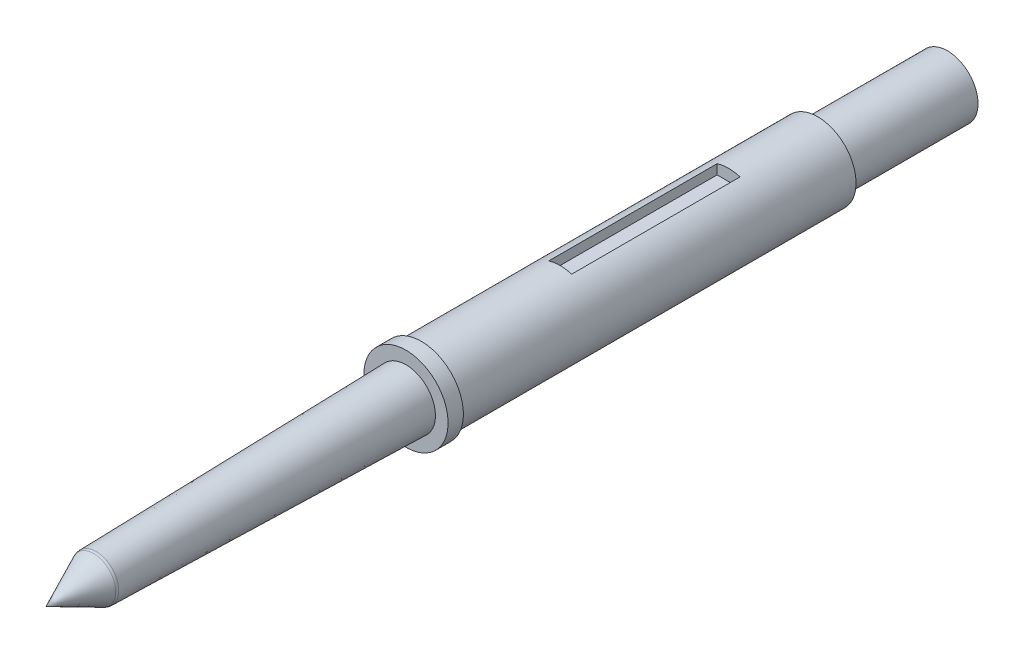
ISO-10303-21;
HEADER;
FILE_DESCRIPTION(('STEP AP214'),'2;1');
FILE_NAME('part.step','',(''),(''),'','','');
FILE_SCHEMA(('AUTOMOTIVE_DESIGN { 1 0 10303 214 1 1 1 1 }'));
ENDSEC;
DATA;
#1=APPLICATION_CONTEXT('core data for automotive mechanical design processes');
#2=APPLICATION_PROTOCOL_DEFINITION('international standard','automotive_design',2000,#1);
#3=PRODUCT_CONTEXT('',#1,'mechanical');
#4=PRODUCT('Part','Part','',(#3));
#5=PRODUCT_RELATED_PRODUCT_CATEGORY('part','',(#4));
#6=PRODUCT_DEFINITION_FORMATION('','',#4);
#7=PRODUCT_DEFINITION_CONTEXT('part definition',#1,'design');
#8=PRODUCT_DEFINITION('design','',#6,#7);
#9=PRODUCT_DEFINITION_SHAPE('','',#8);
#10=(LENGTH_UNIT() NAMED_UNIT(*) SI_UNIT(.MILLI.,.METRE.));
#11=(NAMED_UNIT(*) PLANE_ANGLE_UNIT() SI_UNIT($,.RADIAN.));
#12=(NAMED_UNIT(*) SI_UNIT($,.STERADIAN.) SOLID_ANGLE_UNIT());
#13=UNCERTAINTY_MEASURE_WITH_UNIT(LENGTH_MEASURE(1.E-05),#10,'distance_accuracy_value','');
#14=(GEOMETRIC_REPRESENTATION_CONTEXT(3) GLOBAL_UNCERTAINTY_ASSIGNED_CONTEXT((#13)) GLOBAL_UNIT_ASSIGNED_CONTEXT((#10,
#11,#12)) REPRESENTATION_CONTEXT('',''));
#15=CARTESIAN_POINT('',(0.,0.,0.));
#16=DIRECTION('',(0.,0.,1.));
#17=DIRECTION('',(1.,0.,0.));
#18=AXIS2_PLACEMENT_3D('',#15,#16,#17);
#19=CARTESIAN_POINT('',(0.,0.,176.53));
#20=DIRECTION('',(0.,0.,-1.));
#21=DIRECTION('',(-1.,0.,0.));
#22=AXIS2_PLACEMENT_3D('',#19,#20,#21);
#23=TOROIDAL_SURFACE('',#22,3.41945249806693,1.27);
#24=CARTESIAN_POINT('',(0.,0.,176.558072772658));
#25=DIRECTION('',(0.,0.,-1.));
#26=DIRECTION('',(-1.,0.,0.));
#27=AXIS2_PLACEMENT_3D('',#24,#25,#26);
#28=CIRCLE('',#27,4.68914219221872);
#29=CARTESIAN_POINT('',(-4.68914219221872,0.,176.558072772658));
#30=VERTEX_POINT('',#29);
#31=EDGE_CURVE('E115',#30,#30,#28,.T.);
#32=ORIENTED_EDGE('',*,*,#31,.F.);
#33=EDGE_LOOP('',(#32));
#34=FACE_BOUND('',#33,.T.);
#35=CARTESIAN_POINT('',(0.,0.,177.062823543919));
#36=DIRECTION('',(0.,0.,-1.));
#37=DIRECTION('',(-1.,0.,0.));
#38=AXIS2_PLACEMENT_3D('',#35,#36,#37);
#39=CIRCLE('',#38,4.57227471811872);
#40=CARTESIAN_POINT('',(-4.57227471811872,0.,177.062823543919));
#41=VERTEX_POINT('',#40);
#42=EDGE_CURVE('E143',#41,#41,#39,.T.);
#43=ORIENTED_EDGE('',*,*,#42,.T.);
#44=EDGE_LOOP('',(#43));
#45=FACE_BOUND('',#44,.T.);
#46=ADVANCED_FACE('F49',(#34,#45),#23,.T.);
#47=CARTESIAN_POINT('',(0.,0.,177.062823543919));
#48=DIRECTION('',(0.,0.,-1.));
#49=DIRECTION('',(-1.,0.,0.));
#50=AXIS2_PLACEMENT_3D('',#47,#48,#49);
#51=CONICAL_SURFACE('',#50,4.57227471811872,0.432945223243815);
#52=CARTESIAN_POINT('',(0.,0.,186.955441750041));
#53=VERTEX_POINT('',#52);
#54=VERTEX_LOOP('',#53);
#55=FACE_BOUND('',#54,.T.);
#56=ORIENTED_EDGE('',*,*,#42,.F.);
#57=EDGE_LOOP('',(#56));
#58=FACE_BOUND('',#57,.T.);
#59=ADVANCED_FACE('F168',(#55,#58),#51,.T.);
#60=CARTESIAN_POINT('',(0.,0.,0.));
#61=DIRECTION('',(0.,0.,1.));
#62=DIRECTION('',(1.,0.,0.));
#63=AXIS2_PLACEMENT_3D('',#60,#61,#62);
#64=PLANE('',#63);
#65=CARTESIAN_POINT('',(0.,0.,0.));
#66=DIRECTION('',(0.,0.,-1.));
#67=DIRECTION('',(-1.,0.,0.));
#68=AXIS2_PLACEMENT_3D('',#65,#66,#67);
#69=CIRCLE('',#68,6.34999999999999);
#70=CARTESIAN_POINT('',(-6.34999999999999,0.,0.));
#71=VERTEX_POINT('',#70);
#72=EDGE_CURVE('E140',#71,#71,#69,.T.);
#73=ORIENTED_EDGE('',*,*,#72,.T.);
#74=EDGE_LOOP('',(#73));
#75=FACE_BOUND('',#74,.T.);
#76=ADVANCED_FACE('F173',(#75),#64,.F.);
#77=CARTESIAN_POINT('',(0.,0.,0.));
#78=DIRECTION('',(0.,0.,-1.));
#79=DIRECTION('',(-1.,0.,0.));
#80=AXIS2_PLACEMENT_3D('',#77,#78,#79);
#81=CYLINDRICAL_SURFACE('',#80,6.34999999999999);
#82=CARTESIAN_POINT('',(0.,0.,26.8925));
#83=DIRECTION('',(0.,0.,-1.));
#84=DIRECTION('',(-1.,0.,0.));
#85=AXIS2_PLACEMENT_3D('',#82,#83,#84);
#86=CIRCLE('',#85,6.35);
#87=CARTESIAN_POINT('',(-6.34999999999999,0.,26.8924999999999));
#88=VERTEX_POINT('',#87);
#89=EDGE_CURVE('E137',#88,#88,#86,.T.);
#90=CARTESIAN_POINT('',(-6.34999999999999,0.,0.));
#91=CARTESIAN_POINT('',(-6.34999999999999,0.,0.280130208333333));
#92=CARTESIAN_POINT('',(-6.34999999999999,0.,0.560260416666665));
#93=CARTESIAN_POINT('',(-6.34999999999999,0.,1.12052083333333));
#94=CARTESIAN_POINT('',(-6.34999999999999,0.,1.40065104166666));
#95=CARTESIAN_POINT('',(-6.34999999999999,0.,1.96091145833333));
#96=CARTESIAN_POINT('',(-6.34999999999999,0.,2.24104166666666));
#97=CARTESIAN_POINT('',(-6.34999999999999,0.,2.80130208333333));
#98=CARTESIAN_POINT('',(-6.34999999999999,0.,3.08143229166666));
#99=CARTESIAN_POINT('',(-6.34999999999999,0.,3.64169270833333));
#100=CARTESIAN_POINT('',(-6.34999999999999,0.,3.92182291666666));
#101=CARTESIAN_POINT('',(-6.34999999999999,0.,4.48208333333332));
#102=CARTESIAN_POINT('',(-6.34999999999999,0.,4.76221354166666));
#103=CARTESIAN_POINT('',(-6.34999999999999,0.,5.32247395833332));
#104=CARTESIAN_POINT('',(-6.34999999999999,0.,5.60260416666666));
#105=CARTESIAN_POINT('',(-6.34999999999999,0.,6.16286458333332));
#106=CARTESIAN_POINT('',(-6.34999999999999,0.,6.44299479166665));
#107=CARTESIAN_POINT('',(-6.34999999999999,0.,7.00325520833332));
#108=CARTESIAN_POINT('',(-6.34999999999999,0.,7.28338541666665));
#109=CARTESIAN_POINT('',(-6.34999999999999,0.,7.84364583333332));
#110=CARTESIAN_POINT('',(-6.34999999999999,0.,8.12377604166665));
#111=CARTESIAN_POINT('',(-6.34999999999999,0.,8.68403645833332));
#112=CARTESIAN_POINT('',(-6.34999999999999,0.,8.96416666666665));
#113=CARTESIAN_POINT('',(-6.34999999999999,0.,9.52442708333331));
#114=CARTESIAN_POINT('',(-6.34999999999999,0.,9.80455729166665));
#115=CARTESIAN_POINT('',(-6.34999999999999,0.,10.3648177083333));
#116=CARTESIAN_POINT('',(-6.34999999999999,0.,10.6449479166666));
#117=CARTESIAN_POINT('',(-6.34999999999999,0.,11.2052083333333));
#118=CARTESIAN_POINT('',(-6.34999999999999,0.,11.4853385416666));
#119=CARTESIAN_POINT('',(-6.34999999999999,0.,12.0455989583333));
#120=CARTESIAN_POINT('',(-6.34999999999999,0.,12.3257291666666));
#121=CARTESIAN_POINT('',(-6.34999999999999,0.,12.8859895833333));
#122=CARTESIAN_POINT('',(-6.34999999999999,0.,13.1661197916666));
#123=CARTESIAN_POINT('',(-6.34999999999999,0.,13.7263802083333));
#124=CARTESIAN_POINT('',(-6.34999999999999,0.,14.0065104166666));
#125=CARTESIAN_POINT('',(-6.34999999999999,0.,14.5667708333333));
#126=CARTESIAN_POINT('',(-6.34999999999999,0.,14.8469010416666));
#127=CARTESIAN_POINT('',(-6.34999999999999,0.,15.4071614583333));
#128=CARTESIAN_POINT('',(-6.34999999999999,0.,15.6872916666666));
#129=CARTESIAN_POINT('',(-6.34999999999999,0.,16.2475520833333));
#130=CARTESIAN_POINT('',(-6.34999999999999,0.,16.5276822916666));
#131=CARTESIAN_POINT('',(-6.34999999999999,0.,17.0879427083333));
#132=CARTESIAN_POINT('',(-6.34999999999999,0.,17.3680729166666));
#133=CARTESIAN_POINT('',(-6.34999999999999,0.,17.9283333333333));
#134=CARTESIAN_POINT('',(-6.34999999999999,0.,18.2084635416666));
#135=CARTESIAN_POINT('',(-6.34999999999999,0.,18.7687239583333));
#136=CARTESIAN_POINT('',(-6.34999999999999,0.,19.0488541666666));
#137=CARTESIAN_POINT('',(-6.34999999999999,0.,19.6091145833333));
#138=CARTESIAN_POINT('',(-6.34999999999999,0.,19.8892447916666));
#139=CARTESIAN_POINT('',(-6.34999999999999,0.,20.4495052083333));
#140=CARTESIAN_POINT('',(-6.34999999999999,0.,20.7296354166666));
#141=CARTESIAN_POINT('',(-6.34999999999999,0.,21.2898958333333));
#142=CARTESIAN_POINT('',(-6.34999999999999,0.,21.5700260416666));
#143=CARTESIAN_POINT('',(-6.34999999999999,0.,22.1302864583333));
#144=CARTESIAN_POINT('',(-6.34999999999999,0.,22.4104166666666));
#145=CARTESIAN_POINT('',(-6.34999999999999,0.,22.9706770833333));
#146=CARTESIAN_POINT('',(-6.34999999999999,0.,23.2508072916666));
#147=CARTESIAN_POINT('',(-6.34999999999999,0.,23.8110677083333));
#148=CARTESIAN_POINT('',(-6.34999999999999,0.,24.0911979166666));
#149=CARTESIAN_POINT('',(-6.34999999999999,0.,24.6514583333333));
#150=CARTESIAN_POINT('',(-6.34999999999999,0.,24.9315885416666));
#151=CARTESIAN_POINT('',(-6.34999999999999,0.,25.4918489583333));
#152=CARTESIAN_POINT('',(-6.34999999999999,0.,25.7719791666666));
#153=CARTESIAN_POINT('',(-6.34999999999999,0.,26.3322395833333));
#154=CARTESIAN_POINT('',(-6.34999999999999,0.,26.6123697916666));
#155=CARTESIAN_POINT('',(-6.34999999999999,0.,26.8924999999999));
#156=B_SPLINE_CURVE_WITH_KNOTS('',3,(#90,#91,#92,#93,#94,#95,#96,#97,#98,#99,#100,#101,#102,
#103,#104,#105,#106,#107,#108,#109,#110,#111,#112,#113,#114,#115,#116,#117,#118,#119,#120,#121,
#122,#123,#124,#125,#126,#127,#128,#129,#130,#131,#132,#133,#134,#135,#136,#137,#138,#139,#140,
#141,#142,#143,#144,#145,#146,#147,#148,#149,#150,#151,#152,#153,#154,#155),.UNSPECIFIED.,.F.,
.F.,(4,2,2,2,2,2,2,2,2,2,2,2,2,2,2,2,2,2,2,2,2,2,2,2,2,2,2,2,2,2,2,2,4),(0.,0.840390624999998,
1.68078125,2.52117187499999,3.36156249999999,4.20195312499999,5.04234374999999,5.88273437499999,
6.72312499999999,7.56351562499998,8.40390624999998,9.24429687499998,10.0846875,10.925078125,
11.76546875,12.605859375,13.44625,14.286640625,15.12703125,15.967421875,16.8078125,17.648203125,
18.48859375,19.328984375,20.169375,21.009765625,21.85015625,22.690546875,23.5309375,
24.371328125,25.2117187499999,26.0521093749999,26.8924999999999),.UNSPECIFIED.);
#157=EDGE_CURVE('BSEAM204',#71,#88,#156,.T.);
#158=ORIENTED_EDGE('',*,*,#72,.F.);
#159=ORIENTED_EDGE('',*,*,#89,.T.);
#160=ORIENTED_EDGE('',*,*,#157,.T.);
#161=ORIENTED_EDGE('',*,*,#157,.F.);
#162=EDGE_LOOP('',(#158,#160,#159,#161));
#163=FACE_BOUND('',#162,.T.);
#164=ADVANCED_FACE('F204',(#163),#81,.T.);
#165=CARTESIAN_POINT('',(0.,0.,26.8924999999999));
#166=DIRECTION('',(0.,0.,1.));
#167=DIRECTION('',(1.,0.,0.));
#168=AXIS2_PLACEMENT_3D('',#165,#166,#167);
#169=PLANE('',#168);
#170=ORIENTED_EDGE('',*,*,#89,.F.);
#171=EDGE_LOOP('',(#170));
#172=FACE_BOUND('',#171,.T.);
#173=CARTESIAN_POINT('',(0.,0.,26.8924999999999));
#174=DIRECTION('',(0.,0.,-1.));
#175=DIRECTION('',(-1.,0.,0.));
#176=AXIS2_PLACEMENT_3D('',#173,#174,#175);
#177=CIRCLE('',#176,7.93749999999999);
#178=CARTESIAN_POINT('',(-7.93749999999998,0.,26.8924999999999));
#179=VERTEX_POINT('',#178);
#180=EDGE_CURVE('E134',#179,#179,#177,.T.);
#181=ORIENTED_EDGE('',*,*,#180,.T.);
#182=EDGE_LOOP('',(#181));
#183=FACE_BOUND('',#182,.T.);
#184=ADVANCED_FACE('F201',(#172,#183),#169,.F.);
#185=CARTESIAN_POINT('',(0.,0.,0.));
#186=DIRECTION('',(0.,0.,-1.));
#187=DIRECTION('',(-1.,0.,0.));
#188=AXIS2_PLACEMENT_3D('',#185,#186,#187);
#189=CYLINDRICAL_SURFACE('',#188,7.93749999999999);
#190=DIRECTION('',(0.,0.,-1.));
#191=VECTOR('',#190,1.);
#192=CARTESIAN_POINT('',(2.38125,7.57189241124698,0.));
#193=LINE('',#192,#191);
#194=CARTESIAN_POINT('',(2.38125,7.57189241124698,45.3925664027253));
#195=VERTEX_POINT('',#194);
#196=CARTESIAN_POINT('',(2.38125,7.57189241124698,80.3175664027252));
#197=VERTEX_POINT('',#196);
#198=EDGE_CURVE('E13',#195,#197,#193,.F.);
#199=ORIENTED_EDGE('',*,*,#198,.T.);
#200=CARTESIAN_POINT('',(0.,0.,80.3175664027252));
#201=DIRECTION('',(0.,0.,1.));
#202=DIRECTION('',(1.,0.,0.));
#203=AXIS2_PLACEMENT_3D('',#200,#201,#202);
#204=CIRCLE('',#203,7.93749999999999);
#205=CARTESIAN_POINT('',(-2.38124999999999,7.57189241124698,80.3175664027252));
#206=VERTEX_POINT('',#205);
#207=EDGE_CURVE('E146',#197,#206,#204,.T.);
#208=ORIENTED_EDGE('',*,*,#207,.T.);
#209=DIRECTION('',(0.,0.,-1.));
#210=VECTOR('',#209,1.);
#211=CARTESIAN_POINT('',(-2.38124999999999,7.57189241124698,0.));
#212=LINE('',#211,#210);
#213=CARTESIAN_POINT('',(-2.38124999999999,7.57189241124698,45.3925664027253));
#214=VERTEX_POINT('',#213);
#215=EDGE_CURVE('E56',#206,#214,#212,.T.);
#216=ORIENTED_EDGE('',*,*,#215,.T.);
#217=CARTESIAN_POINT('',(0.,0.,45.3925664027253));
#218=DIRECTION('',(0.,0.,-0.999999999999999));
#219=DIRECTION('',(-1.,0.,0.));
#220=AXIS2_PLACEMENT_3D('',#217,#218,#219);
#221=CIRCLE('',#220,7.93749999999999);
#222=EDGE_CURVE('E148',#214,#195,#221,.T.);
#223=ORIENTED_EDGE('',*,*,#222,.T.);
#224=EDGE_LOOP('',(#199,#208,#216,#223));
#225=FACE_BOUND('',#224,.T.);
#226=ORIENTED_EDGE('',*,*,#180,.F.);
#227=EDGE_LOOP('',(#226));
#228=FACE_BOUND('',#227,.T.);
#229=CARTESIAN_POINT('',(0.,0.,109.125));
#230=DIRECTION('',(0.,0.,-1.));
#231=DIRECTION('',(-1.,0.,0.));
#232=AXIS2_PLACEMENT_3D('',#229,#230,#231);
#233=CIRCLE('',#232,7.93749999999999);
#234=CARTESIAN_POINT('',(-7.93749999999999,0.,109.125));
#235=VERTEX_POINT('',#234);
#236=EDGE_CURVE('E131',#235,#235,#233,.T.);
#237=ORIENTED_EDGE('',*,*,#236,.T.);
#238=EDGE_LOOP('',(#237));
#239=FACE_BOUND('',#238,.T.);
#240=ADVANCED_FACE('F151',(#225,#228,#239),#189,.T.);
#241=CARTESIAN_POINT('',(0.,0.,109.125));
#242=DIRECTION('',(0.,0.,1.));
#243=DIRECTION('',(1.,0.,0.));
#244=AXIS2_PLACEMENT_3D('',#241,#242,#243);
#245=PLANE('',#244);
#246=ORIENTED_EDGE('',*,*,#236,.F.);
#247=EDGE_LOOP('',(#246));
#248=FACE_BOUND('',#247,.T.);
#249=CARTESIAN_POINT('',(0.,0.,109.125));
#250=DIRECTION('',(0.,0.,-1.));
#251=DIRECTION('',(-1.,0.,0.));
#252=AXIS2_PLACEMENT_3D('',#249,#250,#251);
#253=CIRCLE('',#252,8.73124999999999);
#254=CARTESIAN_POINT('',(-8.73124999999998,0.,109.125));
#255=VERTEX_POINT('',#254);
#256=EDGE_CURVE('E128',#255,#255,#253,.T.);
#257=ORIENTED_EDGE('',*,*,#256,.T.);
#258=EDGE_LOOP('',(#257));
#259=FACE_BOUND('',#258,.T.);
#260=ADVANCED_FACE('F194',(#248,#259),#245,.F.);
#261=CARTESIAN_POINT('',(0.,0.,0.));
#262=DIRECTION('',(0.,0.,-1.));
#263=DIRECTION('',(-1.,0.,0.));
#264=AXIS2_PLACEMENT_3D('',#261,#262,#263);
#265=CYLINDRICAL_SURFACE('',#264,8.73124999999999);
#266=CARTESIAN_POINT('',(0.,0.,112.3));
#267=DIRECTION('',(0.,0.,-1.));
#268=DIRECTION('',(-1.,0.,0.));
#269=AXIS2_PLACEMENT_3D('',#266,#267,#268);
#270=CIRCLE('',#269,8.73124999999999);
#271=CARTESIAN_POINT('',(-8.73124999999998,0.,112.3));
#272=VERTEX_POINT('',#271);
#273=EDGE_CURVE('E125',#272,#272,#270,.T.);
#274=CARTESIAN_POINT('',(-8.73124999999998,0.,109.125));
#275=CARTESIAN_POINT('',(-8.73124999999998,0.,109.158072916667));
#276=CARTESIAN_POINT('',(-8.73124999999998,0.,109.191145833333));
#277=CARTESIAN_POINT('',(-8.73124999999998,0.,109.257291666667));
#278=CARTESIAN_POINT('',(-8.73124999999998,0.,109.290364583333));
#279=CARTESIAN_POINT('',(-8.73124999999998,0.,109.356510416667));
#280=CARTESIAN_POINT('',(-8.73124999999998,0.,109.389583333333));
#281=CARTESIAN_POINT('',(-8.73124999999998,0.,109.455729166667));
#282=CARTESIAN_POINT('',(-8.73124999999998,0.,109.488802083333));
#283=CARTESIAN_POINT('',(-8.73124999999998,0.,109.554947916667));
#284=CARTESIAN_POINT('',(-8.73124999999998,0.,109.588020833333));
#285=CARTESIAN_POINT('',(-8.73124999999998,0.,109.654166666667));
#286=CARTESIAN_POINT('',(-8.73124999999998,0.,109.687239583333));
#287=CARTESIAN_POINT('',(-8.73124999999998,0.,109.753385416667));
#288=CARTESIAN_POINT('',(-8.73124999999998,0.,109.786458333333));
#289=CARTESIAN_POINT('',(-8.73124999999998,0.,109.852604166667));
#290=CARTESIAN_POINT('',(-8.73124999999998,0.,109.885677083333));
#291=CARTESIAN_POINT('',(-8.73124999999998,0.,109.951822916667));
#292=CARTESIAN_POINT('',(-8.73124999999998,0.,109.984895833333));
#293=CARTESIAN_POINT('',(-8.73124999999998,0.,110.051041666667));
#294=CARTESIAN_POINT('',(-8.73124999999998,0.,110.084114583333));
#295=CARTESIAN_POINT('',(-8.73124999999998,0.,110.150260416667));
#296=CARTESIAN_POINT('',(-8.73124999999998,0.,110.183333333333));
#297=CARTESIAN_POINT('',(-8.73124999999998,0.,110.249479166667));
#298=CARTESIAN_POINT('',(-8.73124999999998,0.,110.282552083333));
#299=CARTESIAN_POINT('',(-8.73124999999998,0.,110.348697916667));
#300=CARTESIAN_POINT('',(-8.73124999999998,0.,110.381770833333));
#301=CARTESIAN_POINT('',(-8.73124999999998,0.,110.447916666667));
#302=CARTESIAN_POINT('',(-8.73124999999998,0.,110.480989583333));
#303=CARTESIAN_POINT('',(-8.73124999999998,0.,110.547135416667));
#304=CARTESIAN_POINT('',(-8.73124999999998,0.,110.580208333333));
#305=CARTESIAN_POINT('',(-8.73124999999998,0.,110.646354166667));
#306=CARTESIAN_POINT('',(-8.73124999999998,0.,110.679427083333));
#307=CARTESIAN_POINT('',(-8.73124999999998,0.,110.745572916667));
#308=CARTESIAN_POINT('',(-8.73124999999998,0.,110.778645833333));
#309=CARTESIAN_POINT('',(-8.73124999999998,0.,110.844791666667));
#310=CARTESIAN_POINT('',(-8.73124999999998,0.,110.877864583333));
#311=CARTESIAN_POINT('',(-8.73124999999998,0.,110.944010416667));
#312=CARTESIAN_POINT('',(-8.73124999999998,0.,110.977083333333));
#313=CARTESIAN_POINT('',(-8.73124999999998,0.,111.043229166667));
#314=CARTESIAN_POINT('',(-8.73124999999998,0.,111.076302083333));
#315=CARTESIAN_POINT('',(-8.73124999999998,0.,111.142447916667));
#316=CARTESIAN_POINT('',(-8.73124999999998,0.,111.175520833333));
#317=CARTESIAN_POINT('',(-8.73124999999998,0.,111.241666666667));
#318=CARTESIAN_POINT('',(-8.73124999999998,0.,111.274739583333));
#319=CARTESIAN_POINT('',(-8.73124999999998,0.,111.340885416667));
#320=CARTESIAN_POINT('',(-8.73124999999998,0.,111.373958333333));
#321=CARTESIAN_POINT('',(-8.73124999999998,0.,111.440104166667));
#322=CARTESIAN_POINT('',(-8.73124999999998,0.,111.473177083333));
#323=CARTESIAN_POINT('',(-8.73124999999998,0.,111.539322916667));
#324=CARTESIAN_POINT('',(-8.73124999999998,0.,111.572395833333));
#325=CARTESIAN_POINT('',(-8.73124999999998,0.,111.638541666667));
#326=CARTESIAN_POINT('',(-8.73124999999998,0.,111.671614583333));
#327=CARTESIAN_POINT('',(-8.73124999999998,0.,111.737760416667));
#328=CARTESIAN_POINT('',(-8.73124999999998,0.,111.770833333333));
#329=CARTESIAN_POINT('',(-8.73124999999998,0.,111.836979166667));
#330=CARTESIAN_POINT('',(-8.73124999999998,0.,111.870052083333));
#331=CARTESIAN_POINT('',(-8.73124999999998,0.,111.936197916667));
#332=CARTESIAN_POINT('',(-8.73124999999998,0.,111.969270833333));
#333=CARTESIAN_POINT('',(-8.73124999999998,0.,112.035416666667));
#334=CARTESIAN_POINT('',(-8.73124999999998,0.,112.068489583333));
#335=CARTESIAN_POINT('',(-8.73124999999998,0.,112.134635416667));
#336=CARTESIAN_POINT('',(-8.73124999999998,0.,112.167708333333));
#337=CARTESIAN_POINT('',(-8.73124999999998,0.,112.233854166667));
#338=CARTESIAN_POINT('',(-8.73124999999998,0.,112.266927083333));
#339=CARTESIAN_POINT('',(-8.73124999999998,0.,112.3));
#340=B_SPLINE_CURVE_WITH_KNOTS('',3,(#274,#275,#276,#277,#278,#279,#280,#281,#282,#283,#284,
#285,#286,#287,#288,#289,#290,#291,#292,#293,#294,#295,#296,#297,#298,#299,#300,#301,#302,#303,
#304,#305,#306,#307,#308,#309,#310,#311,#312,#313,#314,#315,#316,#317,#318,#319,#320,#321,#322,
#323,#324,#325,#326,#327,#328,#329,#330,#331,#332,#333,#334,#335,#336,#337,#338,#339),
.UNSPECIFIED.,.F.,.F.,(4,2,2,2,2,2,2,2,2,2,2,2,2,2,2,2,2,2,2,2,2,2,2,2,2,2,2,2,2,2,2,2,4),(0.,
0.0992187500000047,0.198437499999995,0.297656249999986,0.396874999999991,0.496093749999982,
0.595312499999986,0.694531249999991,0.793749999999996,0.892968749999987,0.992187499999991,
1.09140625,1.19062499999999,1.28984374999999,1.3890625,1.48828124999999,1.58749999999999,
1.68671875,1.78593749999999,1.88515624999999,1.984375,2.08359374999999,2.18281249999999,
2.28203125,2.38124999999999,2.48046874999999,2.5796875,2.67890625,2.77812499999999,2.87734375,
2.9765625,3.07578124999999,3.175),.UNSPECIFIED.);
#341=EDGE_CURVE('BSEAM186',#255,#272,#340,.T.);
#342=ORIENTED_EDGE('',*,*,#256,.F.);
#343=ORIENTED_EDGE('',*,*,#273,.T.);
#344=ORIENTED_EDGE('',*,*,#341,.T.);
#345=ORIENTED_EDGE('',*,*,#341,.F.);
#346=EDGE_LOOP('',(#342,#344,#343,#345));
#347=FACE_BOUND('',#346,.T.);
#348=ADVANCED_FACE('F186',(#347),#265,.T.);
#349=CARTESIAN_POINT('',(0.,0.,112.3));
#350=DIRECTION('',(0.,0.,-1.));
#351=DIRECTION('',(-1.,0.,0.));
#352=AXIS2_PLACEMENT_3D('',#349,#350,#351);
#353=PLANE('',#352);
#354=ORIENTED_EDGE('',*,*,#273,.F.);
#355=EDGE_LOOP('',(#354));
#356=FACE_BOUND('',#355,.T.);
#357=CARTESIAN_POINT('',(0.,0.,112.3));
#358=DIRECTION('',(0.,0.,-1.));
#359=DIRECTION('',(-1.,0.,0.));
#360=AXIS2_PLACEMENT_3D('',#357,#358,#359);
#361=CIRCLE('',#360,6.10988481674404);
#362=CARTESIAN_POINT('',(-6.10988481674404,0.,112.3));
#363=VERTEX_POINT('',#362);
#364=EDGE_CURVE('E122',#363,#363,#361,.T.);
#365=ORIENTED_EDGE('',*,*,#364,.T.);
#366=EDGE_LOOP('',(#365));
#367=FACE_BOUND('',#366,.T.);
#368=ADVANCED_FACE('F180',(#356,#367),#353,.F.);
#369=CARTESIAN_POINT('',(0.,0.,176.558072772658));
#370=DIRECTION('',(0.,0.,-1.));
#371=DIRECTION('',(-1.,0.,0.));
#372=AXIS2_PLACEMENT_3D('',#369,#370,#371);
#373=CONICAL_SURFACE('',#372,4.68914219221872,0.0221063458831507);
#374=CARTESIAN_POINT('',(-6.10988481674404,0.,112.3));
#375=CARTESIAN_POINT('',(-6.09508541440523,0.,112.969354924715));
#376=CARTESIAN_POINT('',(-6.08028601206643,0.,113.63870984943));
#377=CARTESIAN_POINT('',(-6.05068720738882,0.,114.977419698861));
#378=CARTESIAN_POINT('',(-6.03588780505001,0.,115.646774623576));
#379=CARTESIAN_POINT('',(-6.0062890003724,0.,116.985484473006));
#380=CARTESIAN_POINT('',(-5.99148959803359,0.,117.654839397721));
#381=CARTESIAN_POINT('',(-5.96189079335598,0.,118.993549247152));
#382=CARTESIAN_POINT('',(-5.94709139101718,0.,119.662904171867));
#383=CARTESIAN_POINT('',(-5.91749258633957,0.,121.001614021297));
#384=CARTESIAN_POINT('',(-5.90269318400076,0.,121.670968946013));
#385=CARTESIAN_POINT('',(-5.87309437932315,0.,123.009678795443));
#386=CARTESIAN_POINT('',(-5.85829497698435,0.,123.679033720158));
#387=CARTESIAN_POINT('',(-5.82869617230674,0.,125.017743569589));
#388=CARTESIAN_POINT('',(-5.81389676996793,0.,125.687098494304));
#389=CARTESIAN_POINT('',(-5.78429796529032,0.,127.025808343734));
#390=CARTESIAN_POINT('',(-5.76949856295151,0.,127.695163268449));
#391=CARTESIAN_POINT('',(-5.7398997582739,0.,129.03387311788));
#392=CARTESIAN_POINT('',(-5.7251003559351,0.,129.703228042595));
#393=CARTESIAN_POINT('',(-5.69550155125749,0.,131.041937892025));
#394=CARTESIAN_POINT('',(-5.68070214891868,0.,131.71129281674));
#395=CARTESIAN_POINT('',(-5.65110334424107,0.,133.050002666171));
#396=CARTESIAN_POINT('',(-5.63630394190227,0.,133.719357590886));
#397=CARTESIAN_POINT('',(-5.60670513722466,0.,135.058067440316));
#398=CARTESIAN_POINT('',(-5.59190573488585,0.,135.727422365032));
#399=CARTESIAN_POINT('',(-5.56230693020824,0.,137.066132214462));
#400=CARTESIAN_POINT('',(-5.54750752786943,0.,137.735487139177));
#401=CARTESIAN_POINT('',(-5.51790872319182,0.,139.074196988608));
#402=CARTESIAN_POINT('',(-5.50310932085302,0.,139.743551913323));
#403=CARTESIAN_POINT('',(-5.47351051617541,0.,141.082261762753));
#404=CARTESIAN_POINT('',(-5.4587111138366,0.,141.751616687468));
#405=CARTESIAN_POINT('',(-5.42911230915899,0.,143.090326536899));
#406=CARTESIAN_POINT('',(-5.41431290682018,0.,143.759681461614));
#407=CARTESIAN_POINT('',(-5.38471410214257,0.,145.098391311044));
#408=CARTESIAN_POINT('',(-5.36991469980377,0.,145.767746235759));
#409=CARTESIAN_POINT('',(-5.34031589512616,0.,147.10645608519));
#410=CARTESIAN_POINT('',(-5.32551649278735,0.,147.775811009905));
#411=CARTESIAN_POINT('',(-5.29591768810974,0.,149.114520859335));
#412=CARTESIAN_POINT('',(-5.28111828577094,0.,149.783875784051));
#413=CARTESIAN_POINT('',(-5.25151948109333,0.,151.122585633481));
#414=CARTESIAN_POINT('',(-5.23672007875452,0.,151.791940558196));
#415=CARTESIAN_POINT('',(-5.20712127407691,0.,153.130650407626));
#416=CARTESIAN_POINT('',(-5.1923218717381,0.,153.800005332342));
#417=CARTESIAN_POINT('',(-5.16272306706049,0.,155.138715181772));
#418=CARTESIAN_POINT('',(-5.14792366472169,0.,155.808070106487));
#419=CARTESIAN_POINT('',(-5.11832486004408,0.,157.146779955918));
#420=CARTESIAN_POINT('',(-5.10352545770527,0.,157.816134880633));
#421=CARTESIAN_POINT('',(-5.07392665302766,0.,159.154844730063));
#422=CARTESIAN_POINT('',(-5.05912725068886,0.,159.824199654778));
#423=CARTESIAN_POINT('',(-5.02952844601124,0.,161.162909504209));
#424=CARTESIAN_POINT('',(-5.01472904367244,0.,161.832264428924));
#425=CARTESIAN_POINT('',(-4.98513023899483,0.,163.170974278354));
#426=CARTESIAN_POINT('',(-4.97033083665602,0.,163.84032920307));
#427=CARTESIAN_POINT('',(-4.94073203197841,0.,165.1790390525));
#428=CARTESIAN_POINT('',(-4.92593262963961,0.,165.848393977215));
#429=CARTESIAN_POINT('',(-4.896333824962,0.,167.187103826645));
#430=CARTESIAN_POINT('',(-4.88153442262319,0.,167.856458751361));
#431=CARTESIAN_POINT('',(-4.85193561794558,0.,169.195168600791));
#432=CARTESIAN_POINT('',(-4.83713621560678,0.,169.864523525506));
#433=CARTESIAN_POINT('',(-4.80753741092916,0.,171.203233374937));
#434=CARTESIAN_POINT('',(-4.79273800859036,0.,171.872588299652));
#435=CARTESIAN_POINT('',(-4.76313920391275,0.,173.211298149082));
#436=CARTESIAN_POINT('',(-4.74833980157394,0.,173.880653073797));
#437=CARTESIAN_POINT('',(-4.71874099689633,0.,175.219362923228));
#438=CARTESIAN_POINT('',(-4.70394159455753,0.,175.888717847943));
#439=CARTESIAN_POINT('',(-4.68914219221872,0.,176.558072772658));
#440=B_SPLINE_CURVE_WITH_KNOTS('',3,(#374,#375,#376,#377,#378,#379,#380,#381,#382,#383,#384,
#385,#386,#387,#388,#389,#390,#391,#392,#393,#394,#395,#396,#397,#398,#399,#400,#401,#402,#403,
#404,#405,#406,#407,#408,#409,#410,#411,#412,#413,#414,#415,#416,#417,#418,#419,#420,#421,#422,
#423,#424,#425,#426,#427,#428,#429,#430,#431,#432,#433,#434,#435,#436,#437,#438,#439),
.UNSPECIFIED.,.F.,.F.,(4,2,2,2,2,2,2,2,2,2,2,2,2,2,2,2,2,2,2,2,2,2,2,2,2,2,2,2,2,2,2,2,4),(0.,
2.00855553519204,4.01711107038408,6.02566660557611,8.03422214076815,10.0427776759602,
12.0513332111522,14.0598887463443,16.0684442815363,18.0769998167283,20.0855553519204,
22.0941108871124,24.1026664223044,26.1112219574965,28.1197774926885,30.1283330278806,
32.1368885630726,34.1454440982646,36.1539996334567,38.1625551686487,40.1711107038407,
42.1796662390328,44.1882217742248,46.1967773094168,48.2053328446089,50.2138883798009,
52.2224439149929,54.230999450185,56.239554985377,58.2481105205691,60.2566660557611,
62.2652215909532,64.2737771261452),.UNSPECIFIED.);
#441=EDGE_CURVE('BSEAM164',#363,#30,#440,.T.);
#442=ORIENTED_EDGE('',*,*,#364,.F.);
#443=ORIENTED_EDGE('',*,*,#31,.T.);
#444=ORIENTED_EDGE('',*,*,#441,.T.);
#445=ORIENTED_EDGE('',*,*,#441,.F.);
#446=EDGE_LOOP('',(#442,#444,#443,#445));
#447=FACE_BOUND('',#446,.T.);
#448=ADVANCED_FACE('F164',(#447),#373,.T.);
#449=CARTESIAN_POINT('',(-2.38124999999999,5.55624999999996,80.3175664027252));
#450=DIRECTION('',(-1.,0.,0.));
#451=DIRECTION('',(0.,0.,1.));
#452=AXIS2_PLACEMENT_3D('',#449,#450,#451);
#453=PLANE('',#452);
#454=DIRECTION('',(0.,1.,0.));
#455=VECTOR('',#454,1.);
#456=CARTESIAN_POINT('',(-2.38124999999999,5.55624999999996,80.3175664027252));
#457=LINE('',#456,#455);
#458=CARTESIAN_POINT('',(-2.38124999999999,5.55624999999996,80.3175664027252));
#459=VERTEX_POINT('',#458);
#460=EDGE_CURVE('E63',#459,#206,#457,.T.);
#461=ORIENTED_EDGE('',*,*,#460,.F.);
#462=DIRECTION('',(0.,0.,1.));
#463=VECTOR('',#462,1.);
#464=CARTESIAN_POINT('',(-2.38124999999999,5.55624999999996,80.3175664027252));
#465=LINE('',#464,#463);
#466=CARTESIAN_POINT('',(-2.38124999999999,5.55624999999996,45.3925664027253));
#467=VERTEX_POINT('',#466);
#468=EDGE_CURVE('E91',#467,#459,#465,.T.);
#469=ORIENTED_EDGE('',*,*,#468,.F.);
#470=DIRECTION('',(0.,1.,0.));
#471=VECTOR('',#470,1.);
#472=CARTESIAN_POINT('',(-2.38124999999999,5.55624999999996,45.3925664027253));
#473=LINE('',#472,#471);
#474=EDGE_CURVE('E113',#467,#214,#473,.T.);
#475=ORIENTED_EDGE('',*,*,#474,.T.);
#476=ORIENTED_EDGE('',*,*,#215,.F.);
#477=EDGE_LOOP('',(#461,#469,#475,#476));
#478=FACE_BOUND('',#477,.T.);
#479=ADVANCED_FACE('F88',(#478),#453,.F.);
#480=CARTESIAN_POINT('',(2.38125000000001,5.55624999999998,45.3925664027253));
#481=DIRECTION('',(0.,0.,-0.999999999999999));
#482=DIRECTION('',(-1.,0.,0.));
#483=AXIS2_PLACEMENT_3D('',#480,#481,#482);
#484=PLANE('',#483);
#485=ORIENTED_EDGE('',*,*,#474,.F.);
#486=DIRECTION('',(-1.,0.,0.));
#487=VECTOR('',#486,1.);
#488=CARTESIAN_POINT('',(2.38125000000001,5.55624999999998,45.3925664027253));
#489=LINE('',#488,#487);
#490=CARTESIAN_POINT('',(2.38125000000001,5.55624999999998,45.3925664027253));
#491=VERTEX_POINT('',#490);
#492=EDGE_CURVE('E96',#491,#467,#489,.T.);
#493=ORIENTED_EDGE('',*,*,#492,.F.);
#494=DIRECTION('',(0.,1.,0.));
#495=VECTOR('',#494,1.);
#496=CARTESIAN_POINT('',(2.38125000000001,5.55624999999998,45.3925664027253));
#497=LINE('',#496,#495);
#498=EDGE_CURVE('E116',#491,#195,#497,.T.);
#499=ORIENTED_EDGE('',*,*,#498,.T.);
#500=ORIENTED_EDGE('',*,*,#222,.F.);
#501=EDGE_LOOP('',(#485,#493,#499,#500));
#502=FACE_BOUND('',#501,.T.);
#503=ADVANCED_FACE('F156',(#502),#484,.F.);
#504=CARTESIAN_POINT('',(2.38125000000001,5.55624999999998,80.3175664027252));
#505=DIRECTION('',(1.,0.,0.));
#506=DIRECTION('',(0.,0.,-1.));
#507=AXIS2_PLACEMENT_3D('',#504,#505,#506);
#508=PLANE('',#507);
#509=ORIENTED_EDGE('',*,*,#498,.F.);
#510=DIRECTION('',(0.,0.,-1.));
#511=VECTOR('',#510,1.);
#512=CARTESIAN_POINT('',(2.38125000000001,5.55624999999998,80.3175664027252));
#513=LINE('',#512,#511);
#514=CARTESIAN_POINT('',(2.38125000000001,5.55624999999998,80.3175664027252));
#515=VERTEX_POINT('',#514);
#516=EDGE_CURVE('E105',#515,#491,#513,.T.);
#517=ORIENTED_EDGE('',*,*,#516,.F.);
#518=DIRECTION('',(0.,1.,0.));
#519=VECTOR('',#518,1.);
#520=CARTESIAN_POINT('',(2.38125000000001,5.55624999999998,80.3175664027252));
#521=LINE('',#520,#519);
#522=EDGE_CURVE('E95',#515,#197,#521,.T.);
#523=ORIENTED_EDGE('',*,*,#522,.T.);
#524=ORIENTED_EDGE('',*,*,#198,.F.);
#525=EDGE_LOOP('',(#509,#517,#523,#524));
#526=FACE_BOUND('',#525,.T.);
#527=ADVANCED_FACE('F154',(#526),#508,.F.);
#528=CARTESIAN_POINT('',(2.38125000000001,5.55624999999998,80.3175664027252));
#529=DIRECTION('',(0.,0.,1.));
#530=DIRECTION('',(1.,0.,0.));
#531=AXIS2_PLACEMENT_3D('',#528,#529,#530);
#532=PLANE('',#531);
#533=ORIENTED_EDGE('',*,*,#522,.F.);
#534=DIRECTION('',(1.,0.,0.));
#535=VECTOR('',#534,1.);
#536=CARTESIAN_POINT('',(2.38125000000001,5.55624999999998,80.3175664027252));
#537=LINE('',#536,#535);
#538=EDGE_CURVE('E99',#459,#515,#537,.T.);
#539=ORIENTED_EDGE('',*,*,#538,.F.);
#540=ORIENTED_EDGE('',*,*,#460,.T.);
#541=ORIENTED_EDGE('',*,*,#207,.F.);
#542=EDGE_LOOP('',(#533,#539,#540,#541));
#543=FACE_BOUND('',#542,.T.);
#544=ADVANCED_FACE('F100',(#543),#532,.F.);
#545=CARTESIAN_POINT('',(0.,5.55624999999998,0.));
#546=DIRECTION('',(0.,1.,0.));
#547=DIRECTION('',(0.,0.,1.));
#548=AXIS2_PLACEMENT_3D('',#545,#546,#547);
#549=PLANE('',#548);
#550=ORIENTED_EDGE('',*,*,#468,.T.);
#551=ORIENTED_EDGE('',*,*,#538,.T.);
#552=ORIENTED_EDGE('',*,*,#516,.T.);
#553=ORIENTED_EDGE('',*,*,#492,.T.);
#554=EDGE_LOOP('',(#550,#551,#552,#553));
#555=FACE_BOUND('',#554,.T.);
#556=ADVANCED_FACE('F107',(#555),#549,.T.);
#557=CLOSED_SHELL('',(#46,#59,#76,#164,#184,#240,#260,#348,#368,#448,#479,#503,#527,#544,#556));
#558=MANIFOLD_SOLID_BREP('B2',#557);
#559=ADVANCED_BREP_SHAPE_REPRESENTATION('',(#18,#558),#14);
#560=SHAPE_DEFINITION_REPRESENTATION(#9,#559);
ENDSEC;
END-ISO-10303-21;
